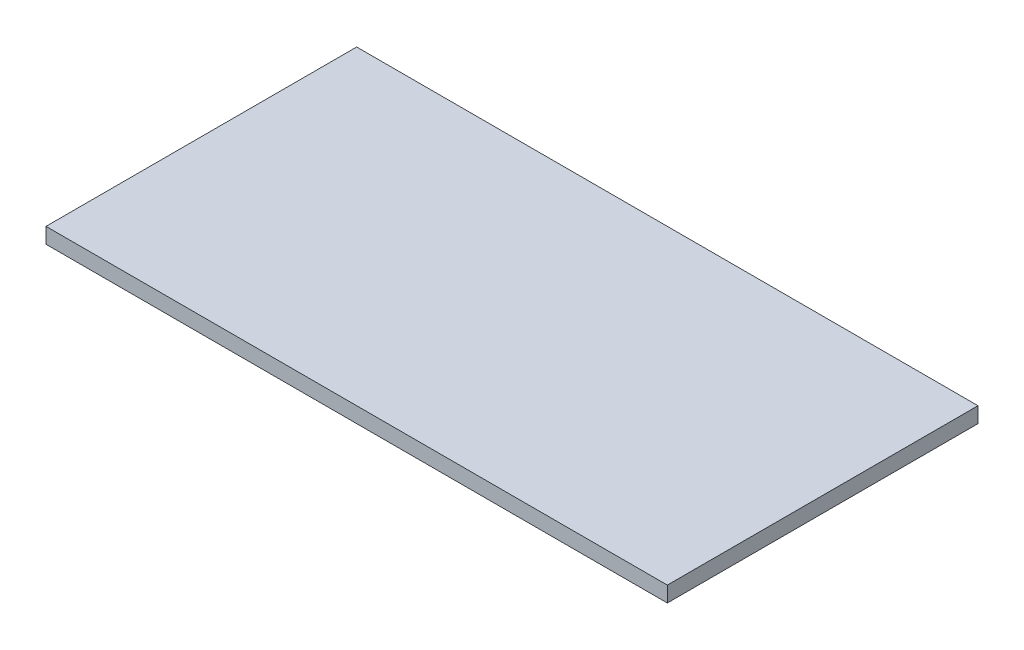
ISO-10303-21;
HEADER;
FILE_DESCRIPTION(('STEP AP214'),'2;1');
FILE_NAME('part.step','',(''),(''),'','','');
FILE_SCHEMA(('AUTOMOTIVE_DESIGN { 1 0 10303 214 1 1 1 1 }'));
ENDSEC;
DATA;
#1=APPLICATION_CONTEXT('core data for automotive mechanical design processes');
#2=APPLICATION_PROTOCOL_DEFINITION('international standard','automotive_design',2000,#1);
#3=PRODUCT_CONTEXT('',#1,'mechanical');
#4=PRODUCT('Part','Part','',(#3));
#5=PRODUCT_RELATED_PRODUCT_CATEGORY('part','',(#4));
#6=PRODUCT_DEFINITION_FORMATION('','',#4);
#7=PRODUCT_DEFINITION_CONTEXT('part definition',#1,'design');
#8=PRODUCT_DEFINITION('design','',#6,#7);
#9=PRODUCT_DEFINITION_SHAPE('','',#8);
#10=(LENGTH_UNIT() NAMED_UNIT(*) SI_UNIT(.MILLI.,.METRE.));
#11=(NAMED_UNIT(*) PLANE_ANGLE_UNIT() SI_UNIT($,.RADIAN.));
#12=(NAMED_UNIT(*) SI_UNIT($,.STERADIAN.) SOLID_ANGLE_UNIT());
#13=UNCERTAINTY_MEASURE_WITH_UNIT(LENGTH_MEASURE(1.E-05),#10,'distance_accuracy_value','');
#14=(GEOMETRIC_REPRESENTATION_CONTEXT(3) GLOBAL_UNCERTAINTY_ASSIGNED_CONTEXT((#13)) GLOBAL_UNIT_ASSIGNED_CONTEXT((#10,
#11,#12)) REPRESENTATION_CONTEXT('',''));
#15=CARTESIAN_POINT('',(0.,0.,0.));
#16=DIRECTION('',(0.,0.,1.));
#17=DIRECTION('',(1.,0.,0.));
#18=AXIS2_PLACEMENT_3D('',#15,#16,#17);
#19=CARTESIAN_POINT('',(0.,2.,0.));
#20=DIRECTION('',(1.,0.,0.));
#21=DIRECTION('',(0.,0.,-1.));
#22=AXIS2_PLACEMENT_3D('',#19,#20,#21);
#23=PLANE('',#22);
#24=DIRECTION('',(0.,0.,1.));
#25=VECTOR('',#24,1.);
#26=CARTESIAN_POINT('',(0.,0.,0.));
#27=LINE('',#26,#25);
#28=CARTESIAN_POINT('',(0.,0.,0.));
#29=VERTEX_POINT('',#28);
#30=CARTESIAN_POINT('',(0.,0.,40.));
#31=VERTEX_POINT('',#30);
#32=EDGE_CURVE('E96',#29,#31,#27,.T.);
#33=ORIENTED_EDGE('',*,*,#32,.T.);
#34=DIRECTION('',(0.,-1.,0.));
#35=VECTOR('',#34,1.);
#36=CARTESIAN_POINT('',(0.,2.,40.));
#37=LINE('',#36,#35);
#38=CARTESIAN_POINT('',(0.,2.,40.));
#39=VERTEX_POINT('',#38);
#40=EDGE_CURVE('E11',#39,#31,#37,.T.);
#41=ORIENTED_EDGE('',*,*,#40,.F.);
#42=DIRECTION('',(0.,0.,1.));
#43=VECTOR('',#42,1.);
#44=CARTESIAN_POINT('',(0.,2.,0.));
#45=LINE('',#44,#43);
#46=CARTESIAN_POINT('',(0.,2.,0.));
#47=VERTEX_POINT('',#46);
#48=EDGE_CURVE('E84',#47,#39,#45,.T.);
#49=ORIENTED_EDGE('',*,*,#48,.F.);
#50=DIRECTION('',(0.,-1.,0.));
#51=VECTOR('',#50,1.);
#52=CARTESIAN_POINT('',(0.,2.,0.));
#53=LINE('',#52,#51);
#54=EDGE_CURVE('E92',#47,#29,#53,.T.);
#55=ORIENTED_EDGE('',*,*,#54,.T.);
#56=EDGE_LOOP('',(#33,#41,#49,#55));
#57=FACE_BOUND('',#56,.T.);
#58=ADVANCED_FACE('F33',(#57),#23,.F.);
#59=CARTESIAN_POINT('',(0.,2.,40.));
#60=DIRECTION('',(0.,0.,-1.));
#61=DIRECTION('',(-1.,0.,0.));
#62=AXIS2_PLACEMENT_3D('',#59,#60,#61);
#63=PLANE('',#62);
#64=DIRECTION('',(1.,0.,0.));
#65=VECTOR('',#64,1.);
#66=CARTESIAN_POINT('',(0.,0.,40.));
#67=LINE('',#66,#65);
#68=CARTESIAN_POINT('',(80.,0.,40.));
#69=VERTEX_POINT('',#68);
#70=EDGE_CURVE('E88',#31,#69,#67,.T.);
#71=ORIENTED_EDGE('',*,*,#70,.T.);
#72=DIRECTION('',(0.,-1.,0.));
#73=VECTOR('',#72,1.);
#74=CARTESIAN_POINT('',(80.,2.,40.));
#75=LINE('',#74,#73);
#76=CARTESIAN_POINT('',(80.,2.,40.));
#77=VERTEX_POINT('',#76);
#78=EDGE_CURVE('E41',#77,#69,#75,.T.);
#79=ORIENTED_EDGE('',*,*,#78,.F.);
#80=DIRECTION('',(1.,0.,0.));
#81=VECTOR('',#80,1.);
#82=CARTESIAN_POINT('',(0.,2.,40.));
#83=LINE('',#82,#81);
#84=EDGE_CURVE('E79',#39,#77,#83,.T.);
#85=ORIENTED_EDGE('',*,*,#84,.F.);
#86=ORIENTED_EDGE('',*,*,#40,.T.);
#87=EDGE_LOOP('',(#71,#79,#85,#86));
#88=FACE_BOUND('',#87,.T.);
#89=ADVANCED_FACE('F87',(#88),#63,.F.);
#90=CARTESIAN_POINT('',(80.,2.,0.));
#91=DIRECTION('',(-1.,0.,0.));
#92=DIRECTION('',(0.,0.,1.));
#93=AXIS2_PLACEMENT_3D('',#90,#91,#92);
#94=PLANE('',#93);
#95=DIRECTION('',(0.,0.,-1.));
#96=VECTOR('',#95,1.);
#97=CARTESIAN_POINT('',(80.,0.,0.));
#98=LINE('',#97,#96);
#99=CARTESIAN_POINT('',(80.,0.,0.));
#100=VERTEX_POINT('',#99);
#101=EDGE_CURVE('E66',#69,#100,#98,.T.);
#102=ORIENTED_EDGE('',*,*,#101,.T.);
#103=DIRECTION('',(0.,-1.,0.));
#104=VECTOR('',#103,1.);
#105=CARTESIAN_POINT('',(80.,2.,0.));
#106=LINE('',#105,#104);
#107=CARTESIAN_POINT('',(80.,2.,0.));
#108=VERTEX_POINT('',#107);
#109=EDGE_CURVE('E89',#108,#100,#106,.T.);
#110=ORIENTED_EDGE('',*,*,#109,.F.);
#111=DIRECTION('',(0.,0.,-1.));
#112=VECTOR('',#111,1.);
#113=CARTESIAN_POINT('',(80.,2.,0.));
#114=LINE('',#113,#112);
#115=EDGE_CURVE('E82',#77,#108,#114,.T.);
#116=ORIENTED_EDGE('',*,*,#115,.F.);
#117=ORIENTED_EDGE('',*,*,#78,.T.);
#118=EDGE_LOOP('',(#102,#110,#116,#117));
#119=FACE_BOUND('',#118,.T.);
#120=ADVANCED_FACE('F90',(#119),#94,.F.);
#121=CARTESIAN_POINT('',(0.,2.,0.));
#122=DIRECTION('',(0.,0.,1.));
#123=DIRECTION('',(1.,0.,0.));
#124=AXIS2_PLACEMENT_3D('',#121,#122,#123);
#125=PLANE('',#124);
#126=DIRECTION('',(-1.,0.,0.));
#127=VECTOR('',#126,1.);
#128=CARTESIAN_POINT('',(0.,0.,0.));
#129=LINE('',#128,#127);
#130=EDGE_CURVE('E72',#100,#29,#129,.T.);
#131=ORIENTED_EDGE('',*,*,#130,.T.);
#132=ORIENTED_EDGE('',*,*,#54,.F.);
#133=DIRECTION('',(-1.,0.,0.));
#134=VECTOR('',#133,1.);
#135=CARTESIAN_POINT('',(0.,2.,0.));
#136=LINE('',#135,#134);
#137=EDGE_CURVE('E49',#108,#47,#136,.T.);
#138=ORIENTED_EDGE('',*,*,#137,.F.);
#139=ORIENTED_EDGE('',*,*,#109,.T.);
#140=EDGE_LOOP('',(#131,#132,#138,#139));
#141=FACE_BOUND('',#140,.T.);
#142=ADVANCED_FACE('F103',(#141),#125,.F.);
#143=CARTESIAN_POINT('',(0.,2.,0.));
#144=DIRECTION('',(0.,1.,0.));
#145=DIRECTION('',(0.,0.,1.));
#146=AXIS2_PLACEMENT_3D('',#143,#144,#145);
#147=PLANE('',#146);
#148=ORIENTED_EDGE('',*,*,#48,.T.);
#149=ORIENTED_EDGE('',*,*,#84,.T.);
#150=ORIENTED_EDGE('',*,*,#115,.T.);
#151=ORIENTED_EDGE('',*,*,#137,.T.);
#152=EDGE_LOOP('',(#148,#149,#150,#151));
#153=FACE_BOUND('',#152,.T.);
#154=ADVANCED_FACE('F80',(#153),#147,.T.);
#155=CARTESIAN_POINT('',(0.,0.,0.));
#156=DIRECTION('',(0.,1.,0.));
#157=DIRECTION('',(0.,0.,1.));
#158=AXIS2_PLACEMENT_3D('',#155,#156,#157);
#159=PLANE('',#158);
#160=ORIENTED_EDGE('',*,*,#32,.F.);
#161=ORIENTED_EDGE('',*,*,#130,.F.);
#162=ORIENTED_EDGE('',*,*,#101,.F.);
#163=ORIENTED_EDGE('',*,*,#70,.F.);
#164=EDGE_LOOP('',(#160,#161,#162,#163));
#165=FACE_BOUND('',#164,.T.);
#166=ADVANCED_FACE('F106',(#165),#159,.F.);
#167=CLOSED_SHELL('',(#58,#89,#120,#142,#154,#166));
#168=MANIFOLD_SOLID_BREP('B2',#167);
#169=ADVANCED_BREP_SHAPE_REPRESENTATION('',(#18,#168),#14);
#170=SHAPE_DEFINITION_REPRESENTATION(#9,#169);
ENDSEC;
END-ISO-10303-21;
